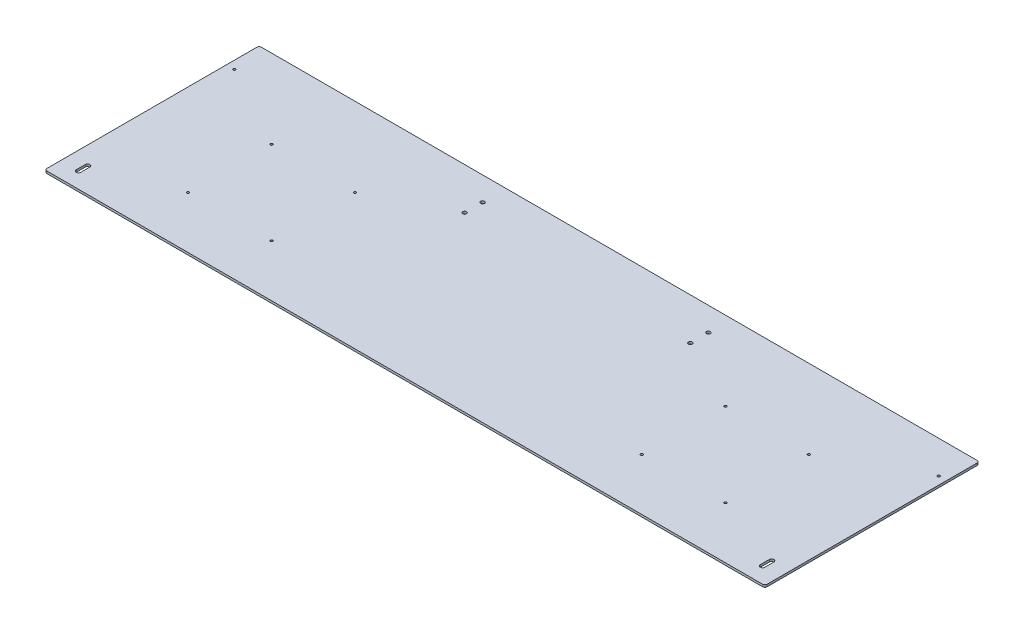
ISO-10303-21;
HEADER;
FILE_DESCRIPTION(('STEP AP214'),'2;1');
FILE_NAME('part.step','',(''),(''),'','','');
FILE_SCHEMA(('AUTOMOTIVE_DESIGN { 1 0 10303 214 1 1 1 1 }'));
ENDSEC;
DATA;
#1=APPLICATION_CONTEXT('core data for automotive mechanical design processes');
#2=APPLICATION_PROTOCOL_DEFINITION('international standard','automotive_design',2000,#1);
#3=PRODUCT_CONTEXT('',#1,'mechanical');
#4=PRODUCT('Part','Part','',(#3));
#5=PRODUCT_RELATED_PRODUCT_CATEGORY('part','',(#4));
#6=PRODUCT_DEFINITION_FORMATION('','',#4);
#7=PRODUCT_DEFINITION_CONTEXT('part definition',#1,'design');
#8=PRODUCT_DEFINITION('design','',#6,#7);
#9=PRODUCT_DEFINITION_SHAPE('','',#8);
#10=(LENGTH_UNIT() NAMED_UNIT(*) SI_UNIT(.MILLI.,.METRE.));
#11=(NAMED_UNIT(*) PLANE_ANGLE_UNIT() SI_UNIT($,.RADIAN.));
#12=(NAMED_UNIT(*) SI_UNIT($,.STERADIAN.) SOLID_ANGLE_UNIT());
#13=UNCERTAINTY_MEASURE_WITH_UNIT(LENGTH_MEASURE(1.E-05),#10,'distance_accuracy_value','');
#14=(GEOMETRIC_REPRESENTATION_CONTEXT(3) GLOBAL_UNCERTAINTY_ASSIGNED_CONTEXT((#13)) GLOBAL_UNIT_ASSIGNED_CONTEXT((#10,
#11,#12)) REPRESENTATION_CONTEXT('',''));
#15=CARTESIAN_POINT('',(0.,0.,0.));
#16=DIRECTION('',(0.,0.,1.));
#17=DIRECTION('',(1.,0.,0.));
#18=AXIS2_PLACEMENT_3D('',#15,#16,#17);
#19=CARTESIAN_POINT('',(2019.3,6.35,-596.9));
#20=DIRECTION('',(0.,-1.,0.));
#21=DIRECTION('',(0.,0.,-1.));
#22=AXIS2_PLACEMENT_3D('',#19,#20,#21);
#23=PLANE('',#22);
#24=CARTESIAN_POINT('',(695.325,6.35,-536.575));
#25=DIRECTION('',(0.,1.,0.));
#26=DIRECTION('',(0.,0.,1.));
#27=AXIS2_PLACEMENT_3D('',#24,#25,#26);
#28=CIRCLE('',#27,5.35781249999999);
#29=CARTESIAN_POINT('',(695.325,6.35,-531.2171875));
#30=VERTEX_POINT('',#29);
#31=EDGE_CURVE('E204',#30,#30,#28,.T.);
#32=ORIENTED_EDGE('',*,*,#31,.F.);
#33=EDGE_LOOP('',(#32));
#34=FACE_BOUND('',#33,.T.);
#35=CARTESIAN_POINT('',(1768.475,6.35,-381.));
#36=DIRECTION('',(0.,1.,0.));
#37=DIRECTION('',(0.,0.,-1.));
#38=AXIS2_PLACEMENT_3D('',#35,#36,#37);
#39=CIRCLE('',#38,3.37819999999987);
#40=CARTESIAN_POINT('',(1768.475,6.35,-384.3782));
#41=VERTEX_POINT('',#40);
#42=EDGE_CURVE('E212',#41,#41,#39,.T.);
#43=ORIENTED_EDGE('',*,*,#42,.F.);
#44=EDGE_LOOP('',(#43));
#45=FACE_BOUND('',#44,.T.);
#46=CARTESIAN_POINT('',(257.175000000002,6.35,-146.05));
#47=DIRECTION('',(0.,1.,0.));
#48=DIRECTION('',(0.,0.,1.));
#49=AXIS2_PLACEMENT_3D('',#46,#47,#48);
#50=CIRCLE('',#49,3.37819999999999);
#51=CARTESIAN_POINT('',(257.175000000002,6.35,-142.6718));
#52=VERTEX_POINT('',#51);
#53=EDGE_CURVE('E220',#52,#52,#50,.T.);
#54=ORIENTED_EDGE('',*,*,#53,.F.);
#55=EDGE_LOOP('',(#54));
#56=FACE_BOUND('',#55,.T.);
#57=CARTESIAN_POINT('',(492.125000000002,6.35,-146.05));
#58=DIRECTION('',(0.,1.,0.));
#59=DIRECTION('',(0.,0.,1.));
#60=AXIS2_PLACEMENT_3D('',#57,#58,#59);
#61=CIRCLE('',#60,3.37820000000011);
#62=CARTESIAN_POINT('',(492.125000000002,6.35,-142.6718));
#63=VERTEX_POINT('',#62);
#64=EDGE_CURVE('E228',#63,#63,#61,.T.);
#65=ORIENTED_EDGE('',*,*,#64,.F.);
#66=EDGE_LOOP('',(#65));
#67=FACE_BOUND('',#66,.T.);
#68=CARTESIAN_POINT('',(492.125,6.35,-381.));
#69=DIRECTION('',(0.,1.,0.));
#70=DIRECTION('',(0.,0.,1.));
#71=AXIS2_PLACEMENT_3D('',#68,#69,#70);
#72=CIRCLE('',#71,3.37819999999989);
#73=CARTESIAN_POINT('',(492.125,6.35,-377.6218));
#74=VERTEX_POINT('',#73);
#75=EDGE_CURVE('E236',#74,#74,#72,.T.);
#76=ORIENTED_EDGE('',*,*,#75,.F.);
#77=EDGE_LOOP('',(#76));
#78=FACE_BOUND('',#77,.T.);
#79=CARTESIAN_POINT('',(257.175,6.35,-381.));
#80=DIRECTION('',(0.,1.,0.));
#81=DIRECTION('',(0.,0.,1.));
#82=AXIS2_PLACEMENT_3D('',#79,#80,#81);
#83=CIRCLE('',#82,3.37819999999999);
#84=CARTESIAN_POINT('',(257.175,6.35,-377.6218));
#85=VERTEX_POINT('',#84);
#86=EDGE_CURVE('E244',#85,#85,#83,.T.);
#87=ORIENTED_EDGE('',*,*,#86,.F.);
#88=EDGE_LOOP('',(#87));
#89=FACE_BOUND('',#88,.T.);
#90=CARTESIAN_POINT('',(1533.525,6.35,-381.));
#91=DIRECTION('',(0.,1.,0.));
#92=DIRECTION('',(0.,0.,-1.));
#93=AXIS2_PLACEMENT_3D('',#90,#91,#92);
#94=CIRCLE('',#93,3.37819999999987);
#95=CARTESIAN_POINT('',(1533.525,6.35,-384.3782));
#96=VERTEX_POINT('',#95);
#97=EDGE_CURVE('E252',#96,#96,#94,.T.);
#98=ORIENTED_EDGE('',*,*,#97,.F.);
#99=EDGE_LOOP('',(#98));
#100=FACE_BOUND('',#99,.T.);
#101=CARTESIAN_POINT('',(1533.525,6.35,-146.05));
#102=DIRECTION('',(0.,1.,0.));
#103=DIRECTION('',(0.,0.,-1.));
#104=AXIS2_PLACEMENT_3D('',#101,#102,#103);
#105=CIRCLE('',#104,3.37820000000012);
#106=CARTESIAN_POINT('',(1533.525,6.35,-149.4282));
#107=VERTEX_POINT('',#106);
#108=EDGE_CURVE('E260',#107,#107,#105,.T.);
#109=ORIENTED_EDGE('',*,*,#108,.F.);
#110=EDGE_LOOP('',(#109));
#111=FACE_BOUND('',#110,.T.);
#112=CARTESIAN_POINT('',(1768.475,6.35,-146.05));
#113=DIRECTION('',(0.,1.,0.));
#114=DIRECTION('',(0.,0.,-1.));
#115=AXIS2_PLACEMENT_3D('',#112,#113,#114);
#116=CIRCLE('',#115,3.37819999999987);
#117=CARTESIAN_POINT('',(1768.475,6.35,-149.4282));
#118=VERTEX_POINT('',#117);
#119=EDGE_CURVE('E268',#118,#118,#116,.T.);
#120=ORIENTED_EDGE('',*,*,#119,.F.);
#121=EDGE_LOOP('',(#120));
#122=FACE_BOUND('',#121,.T.);
#123=CARTESIAN_POINT('',(50.8,6.35,-69.8499999999999));
#124=DIRECTION('',(0.,1.,0.));
#125=DIRECTION('',(0.,0.,1.));
#126=AXIS2_PLACEMENT_3D('',#123,#124,#125);
#127=CIRCLE('',#126,6.3500000000001);
#128=CARTESIAN_POINT('',(57.1500000000001,6.35,-69.8499999999999));
#129=VERTEX_POINT('',#128);
#130=CARTESIAN_POINT('',(44.4499999999999,6.35,-69.8499999999992));
#131=VERTEX_POINT('',#130);
#132=EDGE_CURVE('E276',#129,#131,#127,.T.);
#133=ORIENTED_EDGE('',*,*,#132,.F.);
#134=DIRECTION('',(0.,0.,-1.));
#135=VECTOR('',#134,1.);
#136=CARTESIAN_POINT('',(57.1500000000001,6.35,-69.8499999999999));
#137=LINE('',#136,#135);
#138=CARTESIAN_POINT('',(57.15,6.35,-44.45));
#139=VERTEX_POINT('',#138);
#140=EDGE_CURVE('E287',#139,#129,#137,.T.);
#141=ORIENTED_EDGE('',*,*,#140,.F.);
#142=CARTESIAN_POINT('',(50.8,6.35,-44.4499999999999));
#143=DIRECTION('',(0.,1.,0.));
#144=DIRECTION('',(0.,0.,1.));
#145=AXIS2_PLACEMENT_3D('',#142,#143,#144);
#146=CIRCLE('',#145,6.3500000000001);
#147=CARTESIAN_POINT('',(44.4499999999999,6.35,-44.4500000000006));
#148=VERTEX_POINT('',#147);
#149=EDGE_CURVE('E283',#148,#139,#146,.T.);
#150=ORIENTED_EDGE('',*,*,#149,.F.);
#151=DIRECTION('',(0.,0.,1.));
#152=VECTOR('',#151,1.);
#153=CARTESIAN_POINT('',(44.4499999999999,6.35,-69.8499999999992));
#154=LINE('',#153,#152);
#155=EDGE_CURVE('E279',#131,#148,#154,.T.);
#156=ORIENTED_EDGE('',*,*,#155,.F.);
#157=EDGE_LOOP('',(#133,#141,#150,#156));
#158=FACE_BOUND('',#157,.T.);
#159=CARTESIAN_POINT('',(2019.3,6.35,-596.9));
#160=DIRECTION('',(0.,1.,0.));
#161=DIRECTION('',(0.,0.,-1.));
#162=AXIS2_PLACEMENT_3D('',#159,#160,#161);
#163=CIRCLE('',#162,6.34999999999991);
#164=CARTESIAN_POINT('',(2025.65,6.35,-596.9));
#165=VERTEX_POINT('',#164);
#166=CARTESIAN_POINT('',(2019.3,6.35,-603.25));
#167=VERTEX_POINT('',#166);
#168=EDGE_CURVE('E335',#165,#167,#163,.T.);
#169=ORIENTED_EDGE('',*,*,#168,.T.);
#170=DIRECTION('',(-1.,0.,0.));
#171=VECTOR('',#170,1.);
#172=CARTESIAN_POINT('',(6.34999999999986,6.35,-603.25));
#173=LINE('',#172,#171);
#174=CARTESIAN_POINT('',(6.34999999999986,6.35,-603.25));
#175=VERTEX_POINT('',#174);
#176=EDGE_CURVE('E339',#167,#175,#173,.T.);
#177=ORIENTED_EDGE('',*,*,#176,.T.);
#178=CARTESIAN_POINT('',(6.34999999999986,6.35,-596.9));
#179=DIRECTION('',(0.,1.,0.));
#180=DIRECTION('',(0.,0.,-1.));
#181=AXIS2_PLACEMENT_3D('',#178,#179,#180);
#182=CIRCLE('',#181,6.34999999999991);
#183=CARTESIAN_POINT('',(0.,6.35,-596.9));
#184=VERTEX_POINT('',#183);
#185=EDGE_CURVE('E343',#175,#184,#182,.T.);
#186=ORIENTED_EDGE('',*,*,#185,.T.);
#187=DIRECTION('',(0.,0.,1.));
#188=VECTOR('',#187,1.);
#189=CARTESIAN_POINT('',(0.,6.35,-6.35000000000004));
#190=LINE('',#189,#188);
#191=CARTESIAN_POINT('',(0.,6.35,-6.35000000000004));
#192=VERTEX_POINT('',#191);
#193=EDGE_CURVE('E346',#184,#192,#190,.T.);
#194=ORIENTED_EDGE('',*,*,#193,.T.);
#195=CARTESIAN_POINT('',(6.35,6.35,-6.35));
#196=DIRECTION('',(0.,1.,0.));
#197=DIRECTION('',(0.,0.,-1.));
#198=AXIS2_PLACEMENT_3D('',#195,#196,#197);
#199=CIRCLE('',#198,6.35);
#200=CARTESIAN_POINT('',(6.35000000000004,6.35,0.));
#201=VERTEX_POINT('',#200);
#202=EDGE_CURVE('E349',#192,#201,#199,.T.);
#203=ORIENTED_EDGE('',*,*,#202,.T.);
#204=DIRECTION('',(1.,0.,0.));
#205=VECTOR('',#204,1.);
#206=CARTESIAN_POINT('',(6.35000000000004,6.35,0.));
#207=LINE('',#206,#205);
#208=CARTESIAN_POINT('',(2019.3,6.35,0.));
#209=VERTEX_POINT('',#208);
#210=EDGE_CURVE('E352',#201,#209,#207,.T.);
#211=ORIENTED_EDGE('',*,*,#210,.T.);
#212=CARTESIAN_POINT('',(2019.3,6.35,-6.35));
#213=DIRECTION('',(0.,1.,0.));
#214=DIRECTION('',(0.,0.,1.));
#215=AXIS2_PLACEMENT_3D('',#212,#213,#214);
#216=CIRCLE('',#215,6.34999999999993);
#217=CARTESIAN_POINT('',(2025.65,6.35,-6.35000000000004));
#218=VERTEX_POINT('',#217);
#219=EDGE_CURVE('E355',#209,#218,#216,.T.);
#220=ORIENTED_EDGE('',*,*,#219,.T.);
#221=DIRECTION('',(0.,0.,-1.));
#222=VECTOR('',#221,1.);
#223=CARTESIAN_POINT('',(2025.65,6.35,-6.35000000000004));
#224=LINE('',#223,#222);
#225=EDGE_CURVE('E358',#218,#165,#224,.T.);
#226=ORIENTED_EDGE('',*,*,#225,.T.);
#227=EDGE_LOOP('',(#169,#177,#186,#194,#203,#211,#220,#226));
#228=FACE_BOUND('',#227,.T.);
#229=CARTESIAN_POINT('',(695.325,6.35,-485.775));
#230=DIRECTION('',(0.,1.,0.));
#231=DIRECTION('',(0.,0.,1.));
#232=AXIS2_PLACEMENT_3D('',#229,#230,#231);
#233=CIRCLE('',#232,5.35781249999997);
#234=CARTESIAN_POINT('',(695.325,6.35,-480.4171875));
#235=VERTEX_POINT('',#234);
#236=EDGE_CURVE('E327',#235,#235,#233,.T.);
#237=ORIENTED_EDGE('',*,*,#236,.F.);
#238=EDGE_LOOP('',(#237));
#239=FACE_BOUND('',#238,.T.);
#240=CARTESIAN_POINT('',(1330.325,6.35,-485.775));
#241=DIRECTION('',(0.,1.,0.));
#242=DIRECTION('',(0.,0.,1.));
#243=AXIS2_PLACEMENT_3D('',#240,#241,#242);
#244=CIRCLE('',#243,5.35781250000008);
#245=CARTESIAN_POINT('',(1330.325,6.35,-480.4171875));
#246=VERTEX_POINT('',#245);
#247=EDGE_CURVE('E319',#246,#246,#244,.T.);
#248=ORIENTED_EDGE('',*,*,#247,.F.);
#249=EDGE_LOOP('',(#248));
#250=FACE_BOUND('',#249,.T.);
#251=CARTESIAN_POINT('',(1974.85,6.35,-69.8500000000002));
#252=DIRECTION('',(0.,1.,0.));
#253=DIRECTION('',(0.,0.,-1.));
#254=AXIS2_PLACEMENT_3D('',#251,#252,#253);
#255=CIRCLE('',#254,6.35000000000008);
#256=CARTESIAN_POINT('',(1981.2,6.35,-69.8500000000002));
#257=VERTEX_POINT('',#256);
#258=CARTESIAN_POINT('',(1968.5,6.35,-69.8500000000002));
#259=VERTEX_POINT('',#258);
#260=EDGE_CURVE('E152',#257,#259,#255,.T.);
#261=ORIENTED_EDGE('',*,*,#260,.F.);
#262=DIRECTION('',(0.,0.,-1.));
#263=VECTOR('',#262,1.);
#264=CARTESIAN_POINT('',(1981.2,6.35,-69.8500000000002));
#265=LINE('',#264,#263);
#266=CARTESIAN_POINT('',(1981.2,6.35,-44.4500000000009));
#267=VERTEX_POINT('',#266);
#268=EDGE_CURVE('E180',#267,#257,#265,.T.);
#269=ORIENTED_EDGE('',*,*,#268,.F.);
#270=CARTESIAN_POINT('',(1974.85,6.35,-44.4500000000009));
#271=DIRECTION('',(0.,1.,0.));
#272=DIRECTION('',(0.,0.,-1.));
#273=AXIS2_PLACEMENT_3D('',#270,#271,#272);
#274=CIRCLE('',#273,6.35000000000008);
#275=CARTESIAN_POINT('',(1968.5,6.35,-44.4500000000009));
#276=VERTEX_POINT('',#275);
#277=EDGE_CURVE('E175',#276,#267,#274,.T.);
#278=ORIENTED_EDGE('',*,*,#277,.F.);
#279=DIRECTION('',(0.,0.,1.));
#280=VECTOR('',#279,1.);
#281=CARTESIAN_POINT('',(1968.5,6.35,-69.8500000000002));
#282=LINE('',#281,#280);
#283=EDGE_CURVE('E161',#259,#276,#282,.T.);
#284=ORIENTED_EDGE('',*,*,#283,.F.);
#285=EDGE_LOOP('',(#261,#269,#278,#284));
#286=FACE_BOUND('',#285,.T.);
#287=CARTESIAN_POINT('',(22.225,6.35,-511.175));
#288=DIRECTION('',(0.,1.,0.));
#289=DIRECTION('',(0.,0.,1.));
#290=AXIS2_PLACEMENT_3D('',#287,#288,#289);
#291=CIRCLE('',#290,3.37343749999997);
#292=CARTESIAN_POINT('',(22.225,6.35,-507.8015625));
#293=VERTEX_POINT('',#292);
#294=EDGE_CURVE('E188',#293,#293,#291,.T.);
#295=ORIENTED_EDGE('',*,*,#294,.F.);
#296=EDGE_LOOP('',(#295));
#297=FACE_BOUND('',#296,.T.);
#298=CARTESIAN_POINT('',(2003.425,6.35,-511.175));
#299=DIRECTION('',(0.,1.,0.));
#300=DIRECTION('',(0.,0.,-1.));
#301=AXIS2_PLACEMENT_3D('',#298,#299,#300);
#302=CIRCLE('',#301,3.37343749999994);
#303=CARTESIAN_POINT('',(2003.425,6.35,-514.5484375));
#304=VERTEX_POINT('',#303);
#305=EDGE_CURVE('E521',#304,#304,#302,.T.);
#306=ORIENTED_EDGE('',*,*,#305,.F.);
#307=EDGE_LOOP('',(#306));
#308=FACE_BOUND('',#307,.T.);
#309=CARTESIAN_POINT('',(1330.325,6.35,-536.575));
#310=DIRECTION('',(0.,1.,0.));
#311=DIRECTION('',(0.,0.,1.));
#312=AXIS2_PLACEMENT_3D('',#309,#310,#311);
#313=CIRCLE('',#312,5.3578125000001);
#314=CARTESIAN_POINT('',(1330.325,6.35,-531.2171875));
#315=VERTEX_POINT('',#314);
#316=EDGE_CURVE('E513',#315,#315,#313,.T.);
#317=ORIENTED_EDGE('',*,*,#316,.F.);
#318=EDGE_LOOP('',(#317));
#319=FACE_BOUND('',#318,.T.);
#320=ADVANCED_FACE('F38',(#34,#45,#56,#67,#78,#89,#100,#111,#122,#158,#228,#239,#250,#286,#297,
#308,#319),#23,.F.);
#321=CARTESIAN_POINT('',(2019.3,0.,-596.9));
#322=DIRECTION('',(0.,-1.,0.));
#323=DIRECTION('',(0.,0.,-1.));
#324=AXIS2_PLACEMENT_3D('',#321,#322,#323);
#325=PLANE('',#324);
#326=CARTESIAN_POINT('',(2003.425,0.,-511.175));
#327=DIRECTION('',(0.,1.,0.));
#328=DIRECTION('',(0.,0.,-1.));
#329=AXIS2_PLACEMENT_3D('',#326,#327,#328);
#330=CIRCLE('',#329,3.37343749999994);
#331=CARTESIAN_POINT('',(2003.425,0.,-514.5484375));
#332=VERTEX_POINT('',#331);
#333=EDGE_CURVE('E518',#332,#332,#330,.T.);
#334=ORIENTED_EDGE('',*,*,#333,.T.);
#335=EDGE_LOOP('',(#334));
#336=FACE_BOUND('',#335,.T.);
#337=DIRECTION('',(0.,0.,-1.));
#338=VECTOR('',#337,1.);
#339=CARTESIAN_POINT('',(1981.2,0.,-69.8500000000002));
#340=LINE('',#339,#338);
#341=CARTESIAN_POINT('',(1981.2,0.,-44.4500000000009));
#342=VERTEX_POINT('',#341);
#343=CARTESIAN_POINT('',(1981.2,0.,-69.8500000000002));
#344=VERTEX_POINT('',#343);
#345=EDGE_CURVE('E162',#342,#344,#340,.T.);
#346=ORIENTED_EDGE('',*,*,#345,.T.);
#347=CARTESIAN_POINT('',(1974.85,0.,-69.8500000000002));
#348=DIRECTION('',(0.,1.,0.));
#349=DIRECTION('',(0.,0.,-1.));
#350=AXIS2_PLACEMENT_3D('',#347,#348,#349);
#351=CIRCLE('',#350,6.35000000000008);
#352=CARTESIAN_POINT('',(1968.5,0.,-69.8500000000002));
#353=VERTEX_POINT('',#352);
#354=EDGE_CURVE('E62',#344,#353,#351,.T.);
#355=ORIENTED_EDGE('',*,*,#354,.T.);
#356=DIRECTION('',(0.,0.,1.));
#357=VECTOR('',#356,1.);
#358=CARTESIAN_POINT('',(1968.5,0.,-69.8500000000002));
#359=LINE('',#358,#357);
#360=CARTESIAN_POINT('',(1968.5,0.,-44.4500000000009));
#361=VERTEX_POINT('',#360);
#362=EDGE_CURVE('E168',#353,#361,#359,.T.);
#363=ORIENTED_EDGE('',*,*,#362,.T.);
#364=CARTESIAN_POINT('',(1974.85,0.,-44.4500000000009));
#365=DIRECTION('',(0.,1.,0.));
#366=DIRECTION('',(0.,0.,-1.));
#367=AXIS2_PLACEMENT_3D('',#364,#365,#366);
#368=CIRCLE('',#367,6.35000000000008);
#369=EDGE_CURVE('E191',#361,#342,#368,.T.);
#370=ORIENTED_EDGE('',*,*,#369,.T.);
#371=EDGE_LOOP('',(#346,#355,#363,#370));
#372=FACE_BOUND('',#371,.T.);
#373=CARTESIAN_POINT('',(695.325,0.,-536.575));
#374=DIRECTION('',(0.,1.,0.));
#375=DIRECTION('',(0.,0.,1.));
#376=AXIS2_PLACEMENT_3D('',#373,#374,#375);
#377=CIRCLE('',#376,5.35781249999999);
#378=CARTESIAN_POINT('',(695.325,0.,-531.2171875));
#379=VERTEX_POINT('',#378);
#380=EDGE_CURVE('E170',#379,#379,#377,.T.);
#381=ORIENTED_EDGE('',*,*,#380,.T.);
#382=EDGE_LOOP('',(#381));
#383=FACE_BOUND('',#382,.T.);
#384=CARTESIAN_POINT('',(257.175000000002,0.,-146.05));
#385=DIRECTION('',(0.,1.,0.));
#386=DIRECTION('',(0.,0.,1.));
#387=AXIS2_PLACEMENT_3D('',#384,#385,#386);
#388=CIRCLE('',#387,3.37819999999999);
#389=CARTESIAN_POINT('',(257.175000000002,0.,-142.6718));
#390=VERTEX_POINT('',#389);
#391=EDGE_CURVE('E216',#390,#390,#388,.T.);
#392=ORIENTED_EDGE('',*,*,#391,.T.);
#393=EDGE_LOOP('',(#392));
#394=FACE_BOUND('',#393,.T.);
#395=CARTESIAN_POINT('',(492.125,0.,-381.));
#396=DIRECTION('',(0.,1.,0.));
#397=DIRECTION('',(0.,0.,1.));
#398=AXIS2_PLACEMENT_3D('',#395,#396,#397);
#399=CIRCLE('',#398,3.37819999999989);
#400=CARTESIAN_POINT('',(492.125,0.,-377.6218));
#401=VERTEX_POINT('',#400);
#402=EDGE_CURVE('E232',#401,#401,#399,.T.);
#403=ORIENTED_EDGE('',*,*,#402,.T.);
#404=EDGE_LOOP('',(#403));
#405=FACE_BOUND('',#404,.T.);
#406=CARTESIAN_POINT('',(1533.525,0.,-381.));
#407=DIRECTION('',(0.,1.,0.));
#408=DIRECTION('',(0.,0.,-1.));
#409=AXIS2_PLACEMENT_3D('',#406,#407,#408);
#410=CIRCLE('',#409,3.37819999999987);
#411=CARTESIAN_POINT('',(1533.525,0.,-384.3782));
#412=VERTEX_POINT('',#411);
#413=EDGE_CURVE('E248',#412,#412,#410,.T.);
#414=ORIENTED_EDGE('',*,*,#413,.T.);
#415=EDGE_LOOP('',(#414));
#416=FACE_BOUND('',#415,.T.);
#417=CARTESIAN_POINT('',(1768.475,0.,-146.05));
#418=DIRECTION('',(0.,1.,0.));
#419=DIRECTION('',(0.,0.,-1.));
#420=AXIS2_PLACEMENT_3D('',#417,#418,#419);
#421=CIRCLE('',#420,3.37819999999987);
#422=CARTESIAN_POINT('',(1768.475,0.,-149.4282));
#423=VERTEX_POINT('',#422);
#424=EDGE_CURVE('E264',#423,#423,#421,.T.);
#425=ORIENTED_EDGE('',*,*,#424,.T.);
#426=EDGE_LOOP('',(#425));
#427=FACE_BOUND('',#426,.T.);
#428=CARTESIAN_POINT('',(695.325,0.,-485.775));
#429=DIRECTION('',(0.,1.,0.));
#430=DIRECTION('',(0.,0.,1.));
#431=AXIS2_PLACEMENT_3D('',#428,#429,#430);
#432=CIRCLE('',#431,5.35781249999997);
#433=CARTESIAN_POINT('',(695.325,0.,-480.4171875));
#434=VERTEX_POINT('',#433);
#435=EDGE_CURVE('E323',#434,#434,#432,.T.);
#436=ORIENTED_EDGE('',*,*,#435,.T.);
#437=EDGE_LOOP('',(#436));
#438=FACE_BOUND('',#437,.T.);
#439=CARTESIAN_POINT('',(2019.3,0.,-596.9));
#440=DIRECTION('',(0.,1.,0.));
#441=DIRECTION('',(0.,0.,-1.));
#442=AXIS2_PLACEMENT_3D('',#439,#440,#441);
#443=CIRCLE('',#442,6.34999999999991);
#444=CARTESIAN_POINT('',(2025.65,0.,-596.9));
#445=VERTEX_POINT('',#444);
#446=CARTESIAN_POINT('',(2019.3,0.,-603.25));
#447=VERTEX_POINT('',#446);
#448=EDGE_CURVE('E331',#445,#447,#443,.T.);
#449=ORIENTED_EDGE('',*,*,#448,.F.);
#450=DIRECTION('',(0.,0.,-1.));
#451=VECTOR('',#450,1.);
#452=CARTESIAN_POINT('',(2025.65,0.,-6.35000000000004));
#453=LINE('',#452,#451);
#454=CARTESIAN_POINT('',(2025.65,0.,-6.35000000000004));
#455=VERTEX_POINT('',#454);
#456=EDGE_CURVE('E340',#455,#445,#453,.T.);
#457=ORIENTED_EDGE('',*,*,#456,.F.);
#458=CARTESIAN_POINT('',(2019.3,0.,-6.35));
#459=DIRECTION('',(0.,1.,0.));
#460=DIRECTION('',(0.,0.,1.));
#461=AXIS2_PLACEMENT_3D('',#458,#459,#460);
#462=CIRCLE('',#461,6.34999999999993);
#463=CARTESIAN_POINT('',(2019.3,0.,0.));
#464=VERTEX_POINT('',#463);
#465=EDGE_CURVE('E380',#464,#455,#462,.T.);
#466=ORIENTED_EDGE('',*,*,#465,.F.);
#467=DIRECTION('',(1.,0.,0.));
#468=VECTOR('',#467,1.);
#469=CARTESIAN_POINT('',(6.35000000000004,0.,0.));
#470=LINE('',#469,#468);
#471=CARTESIAN_POINT('',(6.35000000000004,0.,0.));
#472=VERTEX_POINT('',#471);
#473=EDGE_CURVE('E377',#472,#464,#470,.T.);
#474=ORIENTED_EDGE('',*,*,#473,.F.);
#475=CARTESIAN_POINT('',(6.35,0.,-6.35));
#476=DIRECTION('',(0.,1.,0.));
#477=DIRECTION('',(0.,0.,-1.));
#478=AXIS2_PLACEMENT_3D('',#475,#476,#477);
#479=CIRCLE('',#478,6.35);
#480=CARTESIAN_POINT('',(0.,0.,-6.35000000000004));
#481=VERTEX_POINT('',#480);
#482=EDGE_CURVE('E374',#481,#472,#479,.T.);
#483=ORIENTED_EDGE('',*,*,#482,.F.);
#484=DIRECTION('',(0.,0.,1.));
#485=VECTOR('',#484,1.);
#486=CARTESIAN_POINT('',(0.,0.,-6.35000000000004));
#487=LINE('',#486,#485);
#488=CARTESIAN_POINT('',(0.,0.,-596.9));
#489=VERTEX_POINT('',#488);
#490=EDGE_CURVE('E371',#489,#481,#487,.T.);
#491=ORIENTED_EDGE('',*,*,#490,.F.);
#492=CARTESIAN_POINT('',(6.34999999999986,0.,-596.9));
#493=DIRECTION('',(0.,1.,0.));
#494=DIRECTION('',(0.,0.,-1.));
#495=AXIS2_PLACEMENT_3D('',#492,#493,#494);
#496=CIRCLE('',#495,6.34999999999991);
#497=CARTESIAN_POINT('',(6.34999999999986,0.,-603.25));
#498=VERTEX_POINT('',#497);
#499=EDGE_CURVE('E368',#498,#489,#496,.T.);
#500=ORIENTED_EDGE('',*,*,#499,.F.);
#501=DIRECTION('',(-1.,0.,0.));
#502=VECTOR('',#501,1.);
#503=CARTESIAN_POINT('',(6.34999999999986,0.,-603.25));
#504=LINE('',#503,#502);
#505=EDGE_CURVE('E365',#447,#498,#504,.T.);
#506=ORIENTED_EDGE('',*,*,#505,.F.);
#507=EDGE_LOOP('',(#449,#457,#466,#474,#483,#491,#500,#506));
#508=FACE_BOUND('',#507,.T.);
#509=CARTESIAN_POINT('',(1330.325,0.,-485.775));
#510=DIRECTION('',(0.,1.,0.));
#511=DIRECTION('',(0.,0.,1.));
#512=AXIS2_PLACEMENT_3D('',#509,#510,#511);
#513=CIRCLE('',#512,5.35781250000008);
#514=CARTESIAN_POINT('',(1330.325,0.,-480.4171875));
#515=VERTEX_POINT('',#514);
#516=EDGE_CURVE('E318',#515,#515,#513,.T.);
#517=ORIENTED_EDGE('',*,*,#516,.T.);
#518=EDGE_LOOP('',(#517));
#519=FACE_BOUND('',#518,.T.);
#520=DIRECTION('',(0.,0.,-1.));
#521=VECTOR('',#520,1.);
#522=CARTESIAN_POINT('',(57.1500000000001,0.,-69.8499999999999));
#523=LINE('',#522,#521);
#524=CARTESIAN_POINT('',(57.1500000000001,0.,-44.4499999999999));
#525=VERTEX_POINT('',#524);
#526=CARTESIAN_POINT('',(57.15,0.,-69.8499999999999));
#527=VERTEX_POINT('',#526);
#528=EDGE_CURVE('E280',#525,#527,#523,.T.);
#529=ORIENTED_EDGE('',*,*,#528,.T.);
#530=CARTESIAN_POINT('',(50.8,0.,-69.8499999999999));
#531=DIRECTION('',(0.,1.,0.));
#532=DIRECTION('',(0.,0.,1.));
#533=AXIS2_PLACEMENT_3D('',#530,#531,#532);
#534=CIRCLE('',#533,6.3500000000001);
#535=CARTESIAN_POINT('',(44.4499999999999,0.,-69.8499999999992));
#536=VERTEX_POINT('',#535);
#537=EDGE_CURVE('E272',#527,#536,#534,.T.);
#538=ORIENTED_EDGE('',*,*,#537,.T.);
#539=DIRECTION('',(0.,0.,1.));
#540=VECTOR('',#539,1.);
#541=CARTESIAN_POINT('',(44.4499999999999,0.,-69.8499999999992));
#542=LINE('',#541,#540);
#543=CARTESIAN_POINT('',(44.4499999999999,0.,-44.4500000000006));
#544=VERTEX_POINT('',#543);
#545=EDGE_CURVE('E294',#536,#544,#542,.T.);
#546=ORIENTED_EDGE('',*,*,#545,.T.);
#547=CARTESIAN_POINT('',(50.8,0.,-44.4499999999999));
#548=DIRECTION('',(0.,1.,0.));
#549=DIRECTION('',(0.,0.,1.));
#550=AXIS2_PLACEMENT_3D('',#547,#548,#549);
#551=CIRCLE('',#550,6.3500000000001);
#552=EDGE_CURVE('E298',#544,#525,#551,.T.);
#553=ORIENTED_EDGE('',*,*,#552,.T.);
#554=EDGE_LOOP('',(#529,#538,#546,#553));
#555=FACE_BOUND('',#554,.T.);
#556=CARTESIAN_POINT('',(1533.525,0.,-146.05));
#557=DIRECTION('',(0.,1.,0.));
#558=DIRECTION('',(0.,0.,-1.));
#559=AXIS2_PLACEMENT_3D('',#556,#557,#558);
#560=CIRCLE('',#559,3.37820000000012);
#561=CARTESIAN_POINT('',(1533.525,0.,-149.4282));
#562=VERTEX_POINT('',#561);
#563=EDGE_CURVE('E256',#562,#562,#560,.T.);
#564=ORIENTED_EDGE('',*,*,#563,.T.);
#565=EDGE_LOOP('',(#564));
#566=FACE_BOUND('',#565,.T.);
#567=CARTESIAN_POINT('',(257.175,0.,-381.));
#568=DIRECTION('',(0.,1.,0.));
#569=DIRECTION('',(0.,0.,1.));
#570=AXIS2_PLACEMENT_3D('',#567,#568,#569);
#571=CIRCLE('',#570,3.37819999999999);
#572=CARTESIAN_POINT('',(257.175,0.,-377.6218));
#573=VERTEX_POINT('',#572);
#574=EDGE_CURVE('E240',#573,#573,#571,.T.);
#575=ORIENTED_EDGE('',*,*,#574,.T.);
#576=EDGE_LOOP('',(#575));
#577=FACE_BOUND('',#576,.T.);
#578=CARTESIAN_POINT('',(492.125000000002,0.,-146.05));
#579=DIRECTION('',(0.,1.,0.));
#580=DIRECTION('',(0.,0.,1.));
#581=AXIS2_PLACEMENT_3D('',#578,#579,#580);
#582=CIRCLE('',#581,3.37820000000011);
#583=CARTESIAN_POINT('',(492.125000000002,0.,-142.6718));
#584=VERTEX_POINT('',#583);
#585=EDGE_CURVE('E224',#584,#584,#582,.T.);
#586=ORIENTED_EDGE('',*,*,#585,.T.);
#587=EDGE_LOOP('',(#586));
#588=FACE_BOUND('',#587,.T.);
#589=CARTESIAN_POINT('',(1768.475,0.,-381.));
#590=DIRECTION('',(0.,1.,0.));
#591=DIRECTION('',(0.,0.,-1.));
#592=AXIS2_PLACEMENT_3D('',#589,#590,#591);
#593=CIRCLE('',#592,3.37819999999987);
#594=CARTESIAN_POINT('',(1768.475,0.,-384.3782));
#595=VERTEX_POINT('',#594);
#596=EDGE_CURVE('E208',#595,#595,#593,.T.);
#597=ORIENTED_EDGE('',*,*,#596,.T.);
#598=EDGE_LOOP('',(#597));
#599=FACE_BOUND('',#598,.T.);
#600=CARTESIAN_POINT('',(22.225,0.,-511.175));
#601=DIRECTION('',(0.,1.,0.));
#602=DIRECTION('',(0.,0.,1.));
#603=AXIS2_PLACEMENT_3D('',#600,#601,#602);
#604=CIRCLE('',#603,3.37343749999997);
#605=CARTESIAN_POINT('',(22.225,0.,-507.8015625));
#606=VERTEX_POINT('',#605);
#607=EDGE_CURVE('E507',#606,#606,#604,.T.);
#608=ORIENTED_EDGE('',*,*,#607,.T.);
#609=EDGE_LOOP('',(#608));
#610=FACE_BOUND('',#609,.T.);
#611=CARTESIAN_POINT('',(1330.325,0.,-536.575));
#612=DIRECTION('',(0.,1.,0.));
#613=DIRECTION('',(0.,0.,1.));
#614=AXIS2_PLACEMENT_3D('',#611,#612,#613);
#615=CIRCLE('',#614,5.3578125000001);
#616=CARTESIAN_POINT('',(1330.325,0.,-531.2171875));
#617=VERTEX_POINT('',#616);
#618=EDGE_CURVE('E510',#617,#617,#615,.T.);
#619=ORIENTED_EDGE('',*,*,#618,.T.);
#620=EDGE_LOOP('',(#619));
#621=FACE_BOUND('',#620,.T.);
#622=ADVANCED_FACE('F420',(#336,#372,#383,#394,#405,#416,#427,#438,#508,#519,#555,#566,#577,
#588,#599,#610,#621),#325,.T.);
#623=CARTESIAN_POINT('',(2019.3,6.35,-596.9));
#624=DIRECTION('',(0.,-1.,0.));
#625=DIRECTION('',(0.,0.,-1.));
#626=AXIS2_PLACEMENT_3D('',#623,#624,#625);
#627=CYLINDRICAL_SURFACE('',#626,6.34999999999991);
#628=ORIENTED_EDGE('',*,*,#448,.T.);
#629=DIRECTION('',(0.,-1.,0.));
#630=VECTOR('',#629,1.);
#631=CARTESIAN_POINT('',(2019.3,6.35,-603.25));
#632=LINE('',#631,#630);
#633=EDGE_CURVE('E11',#167,#447,#632,.T.);
#634=ORIENTED_EDGE('',*,*,#633,.F.);
#635=ORIENTED_EDGE('',*,*,#168,.F.);
#636=DIRECTION('',(0.,-1.,0.));
#637=VECTOR('',#636,1.);
#638=CARTESIAN_POINT('',(2025.65,6.35,-596.9));
#639=LINE('',#638,#637);
#640=EDGE_CURVE('E361',#165,#445,#639,.T.);
#641=ORIENTED_EDGE('',*,*,#640,.T.);
#642=EDGE_LOOP('',(#628,#634,#635,#641));
#643=FACE_BOUND('',#642,.T.);
#644=ADVANCED_FACE('F40',(#643),#627,.T.);
#645=CARTESIAN_POINT('',(6.34999999999986,6.35,-603.25));
#646=DIRECTION('',(0.,0.,1.));
#647=DIRECTION('',(1.,0.,0.));
#648=AXIS2_PLACEMENT_3D('',#645,#646,#647);
#649=PLANE('',#648);
#650=ORIENTED_EDGE('',*,*,#505,.T.);
#651=DIRECTION('',(0.,-1.,0.));
#652=VECTOR('',#651,1.);
#653=CARTESIAN_POINT('',(6.34999999999986,6.35,-603.25));
#654=LINE('',#653,#652);
#655=EDGE_CURVE('E47',#175,#498,#654,.T.);
#656=ORIENTED_EDGE('',*,*,#655,.F.);
#657=ORIENTED_EDGE('',*,*,#176,.F.);
#658=ORIENTED_EDGE('',*,*,#633,.T.);
#659=EDGE_LOOP('',(#650,#656,#657,#658));
#660=FACE_BOUND('',#659,.T.);
#661=ADVANCED_FACE('F438',(#660),#649,.F.);
#662=CARTESIAN_POINT('',(6.34999999999986,6.35,-596.9));
#663=DIRECTION('',(0.,-1.,0.));
#664=DIRECTION('',(0.,0.,-1.));
#665=AXIS2_PLACEMENT_3D('',#662,#663,#664);
#666=CYLINDRICAL_SURFACE('',#665,6.34999999999991);
#667=ORIENTED_EDGE('',*,*,#499,.T.);
#668=DIRECTION('',(0.,-1.,0.));
#669=VECTOR('',#668,1.);
#670=CARTESIAN_POINT('',(0.,6.35,-596.9));
#671=LINE('',#670,#669);
#672=EDGE_CURVE('E404',#184,#489,#671,.T.);
#673=ORIENTED_EDGE('',*,*,#672,.F.);
#674=ORIENTED_EDGE('',*,*,#185,.F.);
#675=ORIENTED_EDGE('',*,*,#655,.T.);
#676=EDGE_LOOP('',(#667,#673,#674,#675));
#677=FACE_BOUND('',#676,.T.);
#678=ADVANCED_FACE('F414',(#677),#666,.T.);
#679=CARTESIAN_POINT('',(0.,6.35,-6.35000000000004));
#680=DIRECTION('',(1.,0.,0.));
#681=DIRECTION('',(0.,0.,-1.));
#682=AXIS2_PLACEMENT_3D('',#679,#680,#681);
#683=PLANE('',#682);
#684=ORIENTED_EDGE('',*,*,#490,.T.);
#685=DIRECTION('',(0.,-1.,0.));
#686=VECTOR('',#685,1.);
#687=CARTESIAN_POINT('',(0.,6.35,-6.35000000000004));
#688=LINE('',#687,#686);
#689=EDGE_CURVE('E400',#192,#481,#688,.T.);
#690=ORIENTED_EDGE('',*,*,#689,.F.);
#691=ORIENTED_EDGE('',*,*,#193,.F.);
#692=ORIENTED_EDGE('',*,*,#672,.T.);
#693=EDGE_LOOP('',(#684,#690,#691,#692));
#694=FACE_BOUND('',#693,.T.);
#695=ADVANCED_FACE('F426',(#694),#683,.F.);
#696=CARTESIAN_POINT('',(6.35,6.35,-6.35));
#697=DIRECTION('',(0.,-1.,0.));
#698=DIRECTION('',(0.,0.,-1.));
#699=AXIS2_PLACEMENT_3D('',#696,#697,#698);
#700=CYLINDRICAL_SURFACE('',#699,6.35);
#701=ORIENTED_EDGE('',*,*,#482,.T.);
#702=DIRECTION('',(0.,-1.,0.));
#703=VECTOR('',#702,1.);
#704=CARTESIAN_POINT('',(6.35000000000004,6.35,0.));
#705=LINE('',#704,#703);
#706=EDGE_CURVE('E396',#201,#472,#705,.T.);
#707=ORIENTED_EDGE('',*,*,#706,.F.);
#708=ORIENTED_EDGE('',*,*,#202,.F.);
#709=ORIENTED_EDGE('',*,*,#689,.T.);
#710=EDGE_LOOP('',(#701,#707,#708,#709));
#711=FACE_BOUND('',#710,.T.);
#712=ADVANCED_FACE('F430',(#711),#700,.T.);
#713=CARTESIAN_POINT('',(6.35000000000004,6.35,0.));
#714=DIRECTION('',(0.,0.,-1.));
#715=DIRECTION('',(-1.,0.,0.));
#716=AXIS2_PLACEMENT_3D('',#713,#714,#715);
#717=PLANE('',#716);
#718=ORIENTED_EDGE('',*,*,#473,.T.);
#719=DIRECTION('',(0.,-1.,0.));
#720=VECTOR('',#719,1.);
#721=CARTESIAN_POINT('',(2019.3,6.35,0.));
#722=LINE('',#721,#720);
#723=EDGE_CURVE('E392',#209,#464,#722,.T.);
#724=ORIENTED_EDGE('',*,*,#723,.F.);
#725=ORIENTED_EDGE('',*,*,#210,.F.);
#726=ORIENTED_EDGE('',*,*,#706,.T.);
#727=EDGE_LOOP('',(#718,#724,#725,#726));
#728=FACE_BOUND('',#727,.T.);
#729=ADVANCED_FACE('F451',(#728),#717,.F.);
#730=CARTESIAN_POINT('',(2019.3,6.35,-6.35));
#731=DIRECTION('',(0.,-1.,0.));
#732=DIRECTION('',(0.,0.,-1.));
#733=AXIS2_PLACEMENT_3D('',#730,#731,#732);
#734=CYLINDRICAL_SURFACE('',#733,6.34999999999993);
#735=ORIENTED_EDGE('',*,*,#465,.T.);
#736=DIRECTION('',(0.,-1.,0.));
#737=VECTOR('',#736,1.);
#738=CARTESIAN_POINT('',(2025.65,6.35,-6.35000000000004));
#739=LINE('',#738,#737);
#740=EDGE_CURVE('E388',#218,#455,#739,.T.);
#741=ORIENTED_EDGE('',*,*,#740,.F.);
#742=ORIENTED_EDGE('',*,*,#219,.F.);
#743=ORIENTED_EDGE('',*,*,#723,.T.);
#744=EDGE_LOOP('',(#735,#741,#742,#743));
#745=FACE_BOUND('',#744,.T.);
#746=ADVANCED_FACE('F449',(#745),#734,.T.);
#747=CARTESIAN_POINT('',(2025.65,6.35,-6.35000000000004));
#748=DIRECTION('',(-1.,0.,0.));
#749=DIRECTION('',(0.,0.,1.));
#750=AXIS2_PLACEMENT_3D('',#747,#748,#749);
#751=PLANE('',#750);
#752=ORIENTED_EDGE('',*,*,#456,.T.);
#753=ORIENTED_EDGE('',*,*,#640,.F.);
#754=ORIENTED_EDGE('',*,*,#225,.F.);
#755=ORIENTED_EDGE('',*,*,#740,.T.);
#756=EDGE_LOOP('',(#752,#753,#754,#755));
#757=FACE_BOUND('',#756,.T.);
#758=ADVANCED_FACE('F444',(#757),#751,.F.);
#759=CARTESIAN_POINT('',(695.325,6.35,-485.775));
#760=DIRECTION('',(0.,-1.,0.));
#761=DIRECTION('',(0.,0.,-1.));
#762=AXIS2_PLACEMENT_3D('',#759,#760,#761);
#763=CYLINDRICAL_SURFACE('',#762,5.35781249999997);
#764=ORIENTED_EDGE('',*,*,#236,.T.);
#765=EDGE_LOOP('',(#764));
#766=FACE_BOUND('',#765,.T.);
#767=ORIENTED_EDGE('',*,*,#435,.F.);
#768=EDGE_LOOP('',(#767));
#769=FACE_BOUND('',#768,.T.);
#770=ADVANCED_FACE('F471',(#766,#769),#763,.F.);
#771=CARTESIAN_POINT('',(1330.325,6.35,-485.775));
#772=DIRECTION('',(0.,-1.,0.));
#773=DIRECTION('',(0.,0.,-1.));
#774=AXIS2_PLACEMENT_3D('',#771,#772,#773);
#775=CYLINDRICAL_SURFACE('',#774,5.35781250000008);
#776=ORIENTED_EDGE('',*,*,#247,.T.);
#777=EDGE_LOOP('',(#776));
#778=FACE_BOUND('',#777,.T.);
#779=ORIENTED_EDGE('',*,*,#516,.F.);
#780=EDGE_LOOP('',(#779));
#781=FACE_BOUND('',#780,.T.);
#782=ADVANCED_FACE('F478',(#778,#781),#775,.F.);
#783=CARTESIAN_POINT('',(50.8,6.35,-69.8499999999999));
#784=DIRECTION('',(0.,-1.,0.));
#785=DIRECTION('',(0.,0.,-1.));
#786=AXIS2_PLACEMENT_3D('',#783,#784,#785);
#787=CYLINDRICAL_SURFACE('',#786,6.3500000000001);
#788=ORIENTED_EDGE('',*,*,#537,.F.);
#789=DIRECTION('',(0.,-1.,0.));
#790=VECTOR('',#789,1.);
#791=CARTESIAN_POINT('',(57.1500000000001,6.35,-69.8499999999999));
#792=LINE('',#791,#790);
#793=EDGE_CURVE('E290',#129,#527,#792,.T.);
#794=ORIENTED_EDGE('',*,*,#793,.F.);
#795=ORIENTED_EDGE('',*,*,#132,.T.);
#796=DIRECTION('',(0.,-1.,0.));
#797=VECTOR('',#796,1.);
#798=CARTESIAN_POINT('',(44.4499999999999,6.35,-69.8499999999992));
#799=LINE('',#798,#797);
#800=EDGE_CURVE('E314',#131,#536,#799,.T.);
#801=ORIENTED_EDGE('',*,*,#800,.T.);
#802=EDGE_LOOP('',(#788,#794,#795,#801));
#803=FACE_BOUND('',#802,.T.);
#804=ADVANCED_FACE('F483',(#803),#787,.F.);
#805=CARTESIAN_POINT('',(44.4499999999999,6.35,-69.8499999999992));
#806=DIRECTION('',(1.,0.,0.));
#807=DIRECTION('',(0.,0.,-1.));
#808=AXIS2_PLACEMENT_3D('',#805,#806,#807);
#809=PLANE('',#808);
#810=ORIENTED_EDGE('',*,*,#545,.F.);
#811=ORIENTED_EDGE('',*,*,#800,.F.);
#812=ORIENTED_EDGE('',*,*,#155,.T.);
#813=DIRECTION('',(0.,-1.,0.));
#814=VECTOR('',#813,1.);
#815=CARTESIAN_POINT('',(44.4499999999999,6.35,-44.4500000000006));
#816=LINE('',#815,#814);
#817=EDGE_CURVE('E311',#148,#544,#816,.T.);
#818=ORIENTED_EDGE('',*,*,#817,.T.);
#819=EDGE_LOOP('',(#810,#811,#812,#818));
#820=FACE_BOUND('',#819,.T.);
#821=ADVANCED_FACE('F618',(#820),#809,.T.);
#822=CARTESIAN_POINT('',(50.8,6.35,-44.4499999999999));
#823=DIRECTION('',(0.,-1.,0.));
#824=DIRECTION('',(0.,0.,-1.));
#825=AXIS2_PLACEMENT_3D('',#822,#823,#824);
#826=CYLINDRICAL_SURFACE('',#825,6.3500000000001);
#827=ORIENTED_EDGE('',*,*,#552,.F.);
#828=ORIENTED_EDGE('',*,*,#817,.F.);
#829=ORIENTED_EDGE('',*,*,#149,.T.);
#830=DIRECTION('',(0.,-1.,0.));
#831=VECTOR('',#830,1.);
#832=CARTESIAN_POINT('',(57.1500000000001,6.35,-44.4499999999999));
#833=LINE('',#832,#831);
#834=EDGE_CURVE('E308',#139,#525,#833,.T.);
#835=ORIENTED_EDGE('',*,*,#834,.T.);
#836=EDGE_LOOP('',(#827,#828,#829,#835));
#837=FACE_BOUND('',#836,.T.);
#838=ADVANCED_FACE('F614',(#837),#826,.F.);
#839=CARTESIAN_POINT('',(57.1500000000001,6.35,-69.8499999999999));
#840=DIRECTION('',(-1.,0.,0.));
#841=DIRECTION('',(0.,0.,1.));
#842=AXIS2_PLACEMENT_3D('',#839,#840,#841);
#843=PLANE('',#842);
#844=ORIENTED_EDGE('',*,*,#528,.F.);
#845=ORIENTED_EDGE('',*,*,#834,.F.);
#846=ORIENTED_EDGE('',*,*,#140,.T.);
#847=ORIENTED_EDGE('',*,*,#793,.T.);
#848=EDGE_LOOP('',(#844,#845,#846,#847));
#849=FACE_BOUND('',#848,.T.);
#850=ADVANCED_FACE('F610',(#849),#843,.T.);
#851=CARTESIAN_POINT('',(1768.475,6.35,-146.05));
#852=DIRECTION('',(0.,-1.,0.));
#853=DIRECTION('',(0.,0.,-1.));
#854=AXIS2_PLACEMENT_3D('',#851,#852,#853);
#855=CYLINDRICAL_SURFACE('',#854,3.37819999999987);
#856=ORIENTED_EDGE('',*,*,#119,.T.);
#857=EDGE_LOOP('',(#856));
#858=FACE_BOUND('',#857,.T.);
#859=ORIENTED_EDGE('',*,*,#424,.F.);
#860=EDGE_LOOP('',(#859));
#861=FACE_BOUND('',#860,.T.);
#862=ADVANCED_FACE('F606',(#858,#861),#855,.F.);
#863=CARTESIAN_POINT('',(1533.525,6.35,-146.05));
#864=DIRECTION('',(0.,-1.,0.));
#865=DIRECTION('',(0.,0.,-1.));
#866=AXIS2_PLACEMENT_3D('',#863,#864,#865);
#867=CYLINDRICAL_SURFACE('',#866,3.37820000000012);
#868=ORIENTED_EDGE('',*,*,#108,.T.);
#869=EDGE_LOOP('',(#868));
#870=FACE_BOUND('',#869,.T.);
#871=ORIENTED_EDGE('',*,*,#563,.F.);
#872=EDGE_LOOP('',(#871));
#873=FACE_BOUND('',#872,.T.);
#874=ADVANCED_FACE('F602',(#870,#873),#867,.F.);
#875=CARTESIAN_POINT('',(1533.525,6.35,-381.));
#876=DIRECTION('',(0.,-1.,0.));
#877=DIRECTION('',(0.,0.,-1.));
#878=AXIS2_PLACEMENT_3D('',#875,#876,#877);
#879=CYLINDRICAL_SURFACE('',#878,3.37819999999987);
#880=ORIENTED_EDGE('',*,*,#97,.T.);
#881=EDGE_LOOP('',(#880));
#882=FACE_BOUND('',#881,.T.);
#883=ORIENTED_EDGE('',*,*,#413,.F.);
#884=EDGE_LOOP('',(#883));
#885=FACE_BOUND('',#884,.T.);
#886=ADVANCED_FACE('F598',(#882,#885),#879,.F.);
#887=CARTESIAN_POINT('',(257.175,6.35,-381.));
#888=DIRECTION('',(0.,-1.,0.));
#889=DIRECTION('',(0.,0.,-1.));
#890=AXIS2_PLACEMENT_3D('',#887,#888,#889);
#891=CYLINDRICAL_SURFACE('',#890,3.37819999999999);
#892=ORIENTED_EDGE('',*,*,#86,.T.);
#893=EDGE_LOOP('',(#892));
#894=FACE_BOUND('',#893,.T.);
#895=ORIENTED_EDGE('',*,*,#574,.F.);
#896=EDGE_LOOP('',(#895));
#897=FACE_BOUND('',#896,.T.);
#898=ADVANCED_FACE('F594',(#894,#897),#891,.F.);
#899=CARTESIAN_POINT('',(492.125,6.35,-381.));
#900=DIRECTION('',(0.,-1.,0.));
#901=DIRECTION('',(0.,0.,-1.));
#902=AXIS2_PLACEMENT_3D('',#899,#900,#901);
#903=CYLINDRICAL_SURFACE('',#902,3.37819999999989);
#904=ORIENTED_EDGE('',*,*,#75,.T.);
#905=EDGE_LOOP('',(#904));
#906=FACE_BOUND('',#905,.T.);
#907=ORIENTED_EDGE('',*,*,#402,.F.);
#908=EDGE_LOOP('',(#907));
#909=FACE_BOUND('',#908,.T.);
#910=ADVANCED_FACE('F590',(#906,#909),#903,.F.);
#911=CARTESIAN_POINT('',(492.125000000002,6.35,-146.05));
#912=DIRECTION('',(0.,-1.,0.));
#913=DIRECTION('',(0.,0.,-1.));
#914=AXIS2_PLACEMENT_3D('',#911,#912,#913);
#915=CYLINDRICAL_SURFACE('',#914,3.37820000000011);
#916=ORIENTED_EDGE('',*,*,#64,.T.);
#917=EDGE_LOOP('',(#916));
#918=FACE_BOUND('',#917,.T.);
#919=ORIENTED_EDGE('',*,*,#585,.F.);
#920=EDGE_LOOP('',(#919));
#921=FACE_BOUND('',#920,.T.);
#922=ADVANCED_FACE('F586',(#918,#921),#915,.F.);
#923=CARTESIAN_POINT('',(257.175000000002,6.35,-146.05));
#924=DIRECTION('',(0.,-1.,0.));
#925=DIRECTION('',(0.,0.,-1.));
#926=AXIS2_PLACEMENT_3D('',#923,#924,#925);
#927=CYLINDRICAL_SURFACE('',#926,3.37819999999999);
#928=ORIENTED_EDGE('',*,*,#53,.T.);
#929=EDGE_LOOP('',(#928));
#930=FACE_BOUND('',#929,.T.);
#931=ORIENTED_EDGE('',*,*,#391,.F.);
#932=EDGE_LOOP('',(#931));
#933=FACE_BOUND('',#932,.T.);
#934=ADVANCED_FACE('F582',(#930,#933),#927,.F.);
#935=CARTESIAN_POINT('',(1768.475,6.35,-381.));
#936=DIRECTION('',(0.,-1.,0.));
#937=DIRECTION('',(0.,0.,-1.));
#938=AXIS2_PLACEMENT_3D('',#935,#936,#937);
#939=CYLINDRICAL_SURFACE('',#938,3.37819999999987);
#940=ORIENTED_EDGE('',*,*,#42,.T.);
#941=EDGE_LOOP('',(#940));
#942=FACE_BOUND('',#941,.T.);
#943=ORIENTED_EDGE('',*,*,#596,.F.);
#944=EDGE_LOOP('',(#943));
#945=FACE_BOUND('',#944,.T.);
#946=ADVANCED_FACE('F578',(#942,#945),#939,.F.);
#947=CARTESIAN_POINT('',(695.325,6.35,-536.575));
#948=DIRECTION('',(0.,-1.,0.));
#949=DIRECTION('',(0.,0.,-1.));
#950=AXIS2_PLACEMENT_3D('',#947,#948,#949);
#951=CYLINDRICAL_SURFACE('',#950,5.35781249999999);
#952=ORIENTED_EDGE('',*,*,#31,.T.);
#953=EDGE_LOOP('',(#952));
#954=FACE_BOUND('',#953,.T.);
#955=ORIENTED_EDGE('',*,*,#380,.F.);
#956=EDGE_LOOP('',(#955));
#957=FACE_BOUND('',#956,.T.);
#958=ADVANCED_FACE('F575',(#954,#957),#951,.F.);
#959=CARTESIAN_POINT('',(1974.85,6.35,-69.8500000000002));
#960=DIRECTION('',(0.,-1.,0.));
#961=DIRECTION('',(0.,0.,-1.));
#962=AXIS2_PLACEMENT_3D('',#959,#960,#961);
#963=CYLINDRICAL_SURFACE('',#962,6.35000000000008);
#964=ORIENTED_EDGE('',*,*,#354,.F.);
#965=DIRECTION('',(0.,-1.,0.));
#966=VECTOR('',#965,1.);
#967=CARTESIAN_POINT('',(1981.2,6.35,-69.8500000000002));
#968=LINE('',#967,#966);
#969=EDGE_CURVE('E156',#257,#344,#968,.T.);
#970=ORIENTED_EDGE('',*,*,#969,.F.);
#971=ORIENTED_EDGE('',*,*,#260,.T.);
#972=DIRECTION('',(0.,-1.,0.));
#973=VECTOR('',#972,1.);
#974=CARTESIAN_POINT('',(1968.5,6.35,-69.8500000000002));
#975=LINE('',#974,#973);
#976=EDGE_CURVE('E155',#259,#353,#975,.T.);
#977=ORIENTED_EDGE('',*,*,#976,.T.);
#978=EDGE_LOOP('',(#964,#970,#971,#977));
#979=FACE_BOUND('',#978,.T.);
#980=ADVANCED_FACE('F154',(#979),#963,.F.);
#981=CARTESIAN_POINT('',(1968.5,6.35,-69.8500000000002));
#982=DIRECTION('',(1.,0.,0.));
#983=DIRECTION('',(0.,0.,-1.));
#984=AXIS2_PLACEMENT_3D('',#981,#982,#983);
#985=PLANE('',#984);
#986=ORIENTED_EDGE('',*,*,#362,.F.);
#987=ORIENTED_EDGE('',*,*,#976,.F.);
#988=ORIENTED_EDGE('',*,*,#283,.T.);
#989=DIRECTION('',(0.,-1.,0.));
#990=VECTOR('',#989,1.);
#991=CARTESIAN_POINT('',(1968.5,6.35,-44.4500000000009));
#992=LINE('',#991,#990);
#993=EDGE_CURVE('E171',#276,#361,#992,.T.);
#994=ORIENTED_EDGE('',*,*,#993,.T.);
#995=EDGE_LOOP('',(#986,#987,#988,#994));
#996=FACE_BOUND('',#995,.T.);
#997=ADVANCED_FACE('F165',(#996),#985,.T.);
#998=CARTESIAN_POINT('',(1974.85,6.35,-44.4500000000009));
#999=DIRECTION('',(0.,-1.,0.));
#1000=DIRECTION('',(0.,0.,-1.));
#1001=AXIS2_PLACEMENT_3D('',#998,#999,#1000);
#1002=CYLINDRICAL_SURFACE('',#1001,6.35000000000008);
#1003=ORIENTED_EDGE('',*,*,#369,.F.);
#1004=ORIENTED_EDGE('',*,*,#993,.F.);
#1005=ORIENTED_EDGE('',*,*,#277,.T.);
#1006=DIRECTION('',(0.,-1.,0.));
#1007=VECTOR('',#1006,1.);
#1008=CARTESIAN_POINT('',(1981.2,6.35,-44.4500000000009));
#1009=LINE('',#1008,#1007);
#1010=EDGE_CURVE('E54',#267,#342,#1009,.T.);
#1011=ORIENTED_EDGE('',*,*,#1010,.T.);
#1012=EDGE_LOOP('',(#1003,#1004,#1005,#1011));
#1013=FACE_BOUND('',#1012,.T.);
#1014=ADVANCED_FACE('F567',(#1013),#1002,.F.);
#1015=CARTESIAN_POINT('',(1981.2,6.35,-69.8500000000002));
#1016=DIRECTION('',(-1.,0.,0.));
#1017=DIRECTION('',(0.,0.,1.));
#1018=AXIS2_PLACEMENT_3D('',#1015,#1016,#1017);
#1019=PLANE('',#1018);
#1020=ORIENTED_EDGE('',*,*,#345,.F.);
#1021=ORIENTED_EDGE('',*,*,#1010,.F.);
#1022=ORIENTED_EDGE('',*,*,#268,.T.);
#1023=ORIENTED_EDGE('',*,*,#969,.T.);
#1024=EDGE_LOOP('',(#1020,#1021,#1022,#1023));
#1025=FACE_BOUND('',#1024,.T.);
#1026=ADVANCED_FACE('F564',(#1025),#1019,.T.);
#1027=CARTESIAN_POINT('',(22.225,6.35,-511.175));
#1028=DIRECTION('',(0.,-1.,0.));
#1029=DIRECTION('',(0.,0.,-1.));
#1030=AXIS2_PLACEMENT_3D('',#1027,#1028,#1029);
#1031=CYLINDRICAL_SURFACE('',#1030,3.37343749999997);
#1032=ORIENTED_EDGE('',*,*,#294,.T.);
#1033=EDGE_LOOP('',(#1032));
#1034=FACE_BOUND('',#1033,.T.);
#1035=ORIENTED_EDGE('',*,*,#607,.F.);
#1036=EDGE_LOOP('',(#1035));
#1037=FACE_BOUND('',#1036,.T.);
#1038=ADVANCED_FACE('F545',(#1034,#1037),#1031,.F.);
#1039=CARTESIAN_POINT('',(2003.425,6.35,-511.175));
#1040=DIRECTION('',(0.,-1.,0.));
#1041=DIRECTION('',(0.,0.,-1.));
#1042=AXIS2_PLACEMENT_3D('',#1039,#1040,#1041);
#1043=CYLINDRICAL_SURFACE('',#1042,3.37343749999994);
#1044=ORIENTED_EDGE('',*,*,#305,.T.);
#1045=EDGE_LOOP('',(#1044));
#1046=FACE_BOUND('',#1045,.T.);
#1047=ORIENTED_EDGE('',*,*,#333,.F.);
#1048=EDGE_LOOP('',(#1047));
#1049=FACE_BOUND('',#1048,.T.);
#1050=ADVANCED_FACE('F554',(#1046,#1049),#1043,.F.);
#1051=CARTESIAN_POINT('',(1330.325,6.35,-536.575));
#1052=DIRECTION('',(0.,-1.,0.));
#1053=DIRECTION('',(0.,0.,-1.));
#1054=AXIS2_PLACEMENT_3D('',#1051,#1052,#1053);
#1055=CYLINDRICAL_SURFACE('',#1054,5.3578125000001);
#1056=ORIENTED_EDGE('',*,*,#316,.T.);
#1057=EDGE_LOOP('',(#1056));
#1058=FACE_BOUND('',#1057,.T.);
#1059=ORIENTED_EDGE('',*,*,#618,.F.);
#1060=EDGE_LOOP('',(#1059));
#1061=FACE_BOUND('',#1060,.T.);
#1062=ADVANCED_FACE('F552',(#1058,#1061),#1055,.F.);
#1063=CLOSED_SHELL('',(#320,#622,#644,#661,#678,#695,#712,#729,#746,#758,#770,#782,#804,#821,
#838,#850,#862,#874,#886,#898,#910,#922,#934,#946,#958,#980,#997,#1014,#1026,#1038,#1050,#1062));
#1064=MANIFOLD_SOLID_BREP('B2',#1063);
#1065=ADVANCED_BREP_SHAPE_REPRESENTATION('',(#18,#1064),#14);
#1066=SHAPE_DEFINITION_REPRESENTATION(#9,#1065);
ENDSEC;
END-ISO-10303-21;
